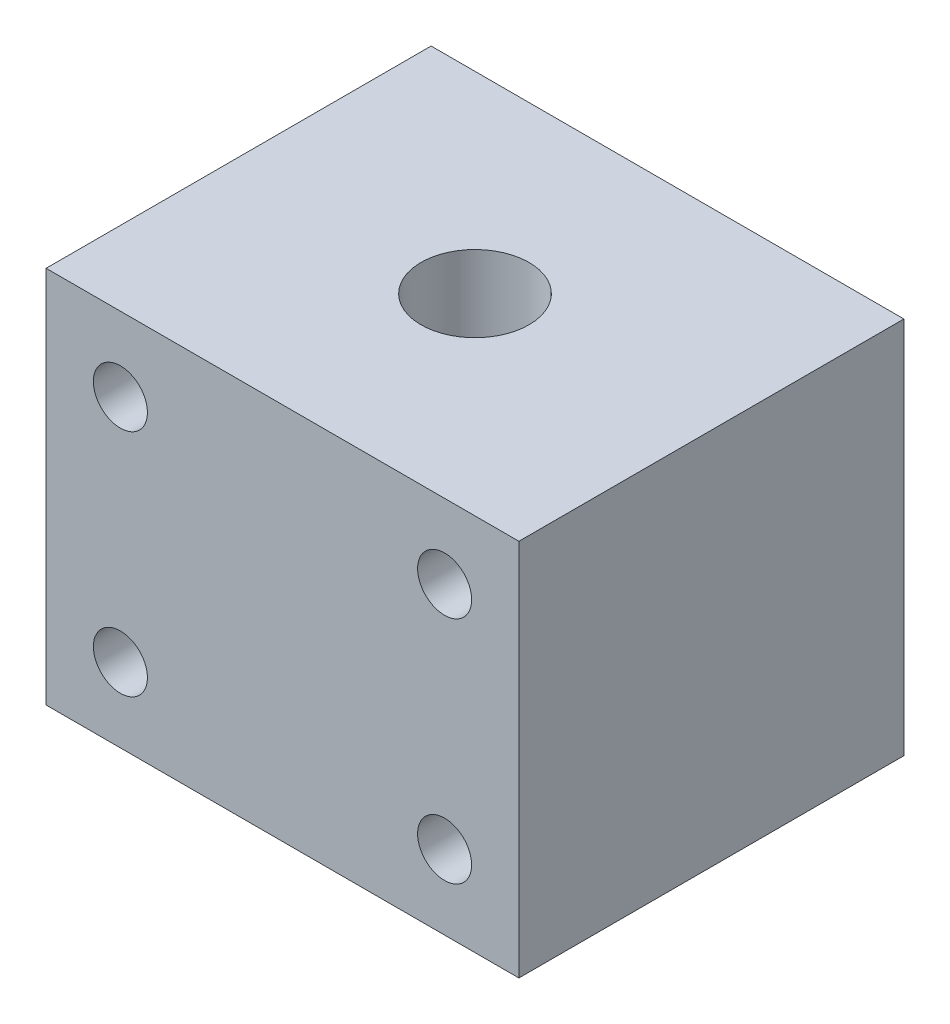
ISO-10303-21;
HEADER;
FILE_DESCRIPTION(('STEP AP214'),'2;1');
FILE_NAME('part.step','',(''),(''),'','','');
FILE_SCHEMA(('AUTOMOTIVE_DESIGN { 1 0 10303 214 1 1 1 1 }'));
ENDSEC;
DATA;
#1=APPLICATION_CONTEXT('core data for automotive mechanical design processes');
#2=APPLICATION_PROTOCOL_DEFINITION('international standard','automotive_design',2000,#1);
#3=PRODUCT_CONTEXT('',#1,'mechanical');
#4=PRODUCT('Part','Part','',(#3));
#5=PRODUCT_RELATED_PRODUCT_CATEGORY('part','',(#4));
#6=PRODUCT_DEFINITION_FORMATION('','',#4);
#7=PRODUCT_DEFINITION_CONTEXT('part definition',#1,'design');
#8=PRODUCT_DEFINITION('design','',#6,#7);
#9=PRODUCT_DEFINITION_SHAPE('','',#8);
#10=(LENGTH_UNIT() NAMED_UNIT(*) SI_UNIT(.MILLI.,.METRE.));
#11=(NAMED_UNIT(*) PLANE_ANGLE_UNIT() SI_UNIT($,.RADIAN.));
#12=(NAMED_UNIT(*) SI_UNIT($,.STERADIAN.) SOLID_ANGLE_UNIT());
#13=UNCERTAINTY_MEASURE_WITH_UNIT(LENGTH_MEASURE(1.E-05),#10,'distance_accuracy_value','');
#14=(GEOMETRIC_REPRESENTATION_CONTEXT(3) GLOBAL_UNCERTAINTY_ASSIGNED_CONTEXT((#13)) GLOBAL_UNIT_ASSIGNED_CONTEXT((#10,
#11,#12)) REPRESENTATION_CONTEXT('',''));
#15=CARTESIAN_POINT('',(0.,0.,0.));
#16=DIRECTION('',(0.,0.,1.));
#17=DIRECTION('',(1.,0.,0.));
#18=AXIS2_PLACEMENT_3D('',#15,#16,#17);
#19=CARTESIAN_POINT('',(0.,0.,28.5));
#20=DIRECTION('',(0.,0.,-1.));
#21=DIRECTION('',(-1.,0.,0.));
#22=AXIS2_PLACEMENT_3D('',#19,#20,#21);
#23=PLANE('',#22);
#24=DIRECTION('',(0.,-1.,0.));
#25=VECTOR('',#24,1.);
#26=CARTESIAN_POINT('',(0.,0.,28.5));
#27=LINE('',#26,#25);
#28=CARTESIAN_POINT('',(0.,28.,28.5));
#29=VERTEX_POINT('',#28);
#30=CARTESIAN_POINT('',(0.,0.,28.5));
#31=VERTEX_POINT('',#30);
#32=EDGE_CURVE('E85',#29,#31,#27,.T.);
#33=ORIENTED_EDGE('',*,*,#32,.T.);
#34=DIRECTION('',(1.,0.,0.));
#35=VECTOR('',#34,1.);
#36=CARTESIAN_POINT('',(0.,0.,28.5));
#37=LINE('',#36,#35);
#38=CARTESIAN_POINT('',(35.,0.,28.5));
#39=VERTEX_POINT('',#38);
#40=EDGE_CURVE('E80',#31,#39,#37,.T.);
#41=ORIENTED_EDGE('',*,*,#40,.T.);
#42=DIRECTION('',(0.,1.,0.));
#43=VECTOR('',#42,1.);
#44=CARTESIAN_POINT('',(35.,0.,28.5));
#45=LINE('',#44,#43);
#46=CARTESIAN_POINT('',(35.,28.,28.5));
#47=VERTEX_POINT('',#46);
#48=EDGE_CURVE('E83',#39,#47,#45,.T.);
#49=ORIENTED_EDGE('',*,*,#48,.T.);
#50=DIRECTION('',(-1.,0.,0.));
#51=VECTOR('',#50,1.);
#52=CARTESIAN_POINT('',(0.,28.,28.5));
#53=LINE('',#52,#51);
#54=EDGE_CURVE('E50',#47,#29,#53,.T.);
#55=ORIENTED_EDGE('',*,*,#54,.T.);
#56=EDGE_LOOP('',(#33,#41,#49,#55));
#57=FACE_BOUND('',#56,.T.);
#58=CARTESIAN_POINT('',(5.5,22.5,28.5));
#59=DIRECTION('',(0.,0.,1.));
#60=DIRECTION('',(1.,0.,0.));
#61=AXIS2_PLACEMENT_3D('',#58,#59,#60);
#62=CIRCLE('',#61,2.);
#63=CARTESIAN_POINT('',(3.5,22.5,28.5));
#64=VERTEX_POINT('',#63);
#65=EDGE_CURVE('E100',#64,#64,#62,.T.);
#66=ORIENTED_EDGE('',*,*,#65,.F.);
#67=EDGE_LOOP('',(#66));
#68=FACE_BOUND('',#67,.T.);
#69=CARTESIAN_POINT('',(29.5,22.5,28.5));
#70=DIRECTION('',(0.,0.,1.));
#71=DIRECTION('',(1.,0.,0.));
#72=AXIS2_PLACEMENT_3D('',#69,#70,#71);
#73=CIRCLE('',#72,2.);
#74=CARTESIAN_POINT('',(27.5,22.5,28.5));
#75=VERTEX_POINT('',#74);
#76=EDGE_CURVE('E115',#75,#75,#73,.T.);
#77=ORIENTED_EDGE('',*,*,#76,.F.);
#78=EDGE_LOOP('',(#77));
#79=FACE_BOUND('',#78,.T.);
#80=CARTESIAN_POINT('',(5.5,5.5,28.5));
#81=DIRECTION('',(0.,0.,1.));
#82=DIRECTION('',(1.,0.,0.));
#83=AXIS2_PLACEMENT_3D('',#80,#81,#82);
#84=CIRCLE('',#83,2.);
#85=CARTESIAN_POINT('',(3.5,5.5,28.5));
#86=VERTEX_POINT('',#85);
#87=EDGE_CURVE('E121',#86,#86,#84,.T.);
#88=ORIENTED_EDGE('',*,*,#87,.F.);
#89=EDGE_LOOP('',(#88));
#90=FACE_BOUND('',#89,.T.);
#91=CARTESIAN_POINT('',(29.5,5.5,28.5));
#92=DIRECTION('',(0.,0.,1.));
#93=DIRECTION('',(1.,0.,0.));
#94=AXIS2_PLACEMENT_3D('',#91,#92,#93);
#95=CIRCLE('',#94,2.);
#96=CARTESIAN_POINT('',(27.5,5.5,28.5));
#97=VERTEX_POINT('',#96);
#98=EDGE_CURVE('E127',#97,#97,#95,.T.);
#99=ORIENTED_EDGE('',*,*,#98,.F.);
#100=EDGE_LOOP('',(#99));
#101=FACE_BOUND('',#100,.T.);
#102=ADVANCED_FACE('F33',(#57,#68,#79,#90,#101),#23,.F.);
#103=CARTESIAN_POINT('',(0.,0.,0.));
#104=DIRECTION('',(0.,0.,-1.));
#105=DIRECTION('',(-1.,0.,0.));
#106=AXIS2_PLACEMENT_3D('',#103,#104,#105);
#107=PLANE('',#106);
#108=CARTESIAN_POINT('',(5.5,5.5,0.));
#109=DIRECTION('',(0.,0.,1.));
#110=DIRECTION('',(1.,0.,0.));
#111=AXIS2_PLACEMENT_3D('',#108,#109,#110);
#112=CIRCLE('',#111,2.);
#113=CARTESIAN_POINT('',(3.5,5.5,0.));
#114=VERTEX_POINT('',#113);
#115=EDGE_CURVE('E124',#114,#114,#112,.T.);
#116=ORIENTED_EDGE('',*,*,#115,.T.);
#117=EDGE_LOOP('',(#116));
#118=FACE_BOUND('',#117,.T.);
#119=CARTESIAN_POINT('',(5.5,22.5,0.));
#120=DIRECTION('',(0.,0.,1.));
#121=DIRECTION('',(1.,0.,0.));
#122=AXIS2_PLACEMENT_3D('',#119,#120,#121);
#123=CIRCLE('',#122,2.);
#124=CARTESIAN_POINT('',(3.5,22.5,0.));
#125=VERTEX_POINT('',#124);
#126=EDGE_CURVE('E112',#125,#125,#123,.T.);
#127=ORIENTED_EDGE('',*,*,#126,.T.);
#128=EDGE_LOOP('',(#127));
#129=FACE_BOUND('',#128,.T.);
#130=DIRECTION('',(0.,-1.,0.));
#131=VECTOR('',#130,1.);
#132=CARTESIAN_POINT('',(0.,0.,0.));
#133=LINE('',#132,#131);
#134=CARTESIAN_POINT('',(0.,28.,0.));
#135=VERTEX_POINT('',#134);
#136=CARTESIAN_POINT('',(0.,0.,0.));
#137=VERTEX_POINT('',#136);
#138=EDGE_CURVE('E97',#135,#137,#133,.T.);
#139=ORIENTED_EDGE('',*,*,#138,.F.);
#140=DIRECTION('',(-1.,0.,0.));
#141=VECTOR('',#140,1.);
#142=CARTESIAN_POINT('',(0.,28.,0.));
#143=LINE('',#142,#141);
#144=CARTESIAN_POINT('',(35.,28.,0.));
#145=VERTEX_POINT('',#144);
#146=EDGE_CURVE('E73',#145,#135,#143,.T.);
#147=ORIENTED_EDGE('',*,*,#146,.F.);
#148=DIRECTION('',(0.,1.,0.));
#149=VECTOR('',#148,1.);
#150=CARTESIAN_POINT('',(35.,0.,0.));
#151=LINE('',#150,#149);
#152=CARTESIAN_POINT('',(35.,0.,0.));
#153=VERTEX_POINT('',#152);
#154=EDGE_CURVE('E67',#153,#145,#151,.T.);
#155=ORIENTED_EDGE('',*,*,#154,.F.);
#156=DIRECTION('',(1.,0.,0.));
#157=VECTOR('',#156,1.);
#158=CARTESIAN_POINT('',(0.,0.,0.));
#159=LINE('',#158,#157);
#160=EDGE_CURVE('E89',#137,#153,#159,.T.);
#161=ORIENTED_EDGE('',*,*,#160,.F.);
#162=EDGE_LOOP('',(#139,#147,#155,#161));
#163=FACE_BOUND('',#162,.T.);
#164=CARTESIAN_POINT('',(29.5,22.5,0.));
#165=DIRECTION('',(0.,0.,1.));
#166=DIRECTION('',(1.,0.,0.));
#167=AXIS2_PLACEMENT_3D('',#164,#165,#166);
#168=CIRCLE('',#167,2.);
#169=CARTESIAN_POINT('',(27.5,22.5,0.));
#170=VERTEX_POINT('',#169);
#171=EDGE_CURVE('E118',#170,#170,#168,.T.);
#172=ORIENTED_EDGE('',*,*,#171,.T.);
#173=EDGE_LOOP('',(#172));
#174=FACE_BOUND('',#173,.T.);
#175=CARTESIAN_POINT('',(29.5,5.5,0.));
#176=DIRECTION('',(0.,0.,1.));
#177=DIRECTION('',(1.,0.,0.));
#178=AXIS2_PLACEMENT_3D('',#175,#176,#177);
#179=CIRCLE('',#178,2.);
#180=CARTESIAN_POINT('',(27.5,5.5,0.));
#181=VERTEX_POINT('',#180);
#182=EDGE_CURVE('E130',#181,#181,#179,.T.);
#183=ORIENTED_EDGE('',*,*,#182,.T.);
#184=EDGE_LOOP('',(#183));
#185=FACE_BOUND('',#184,.T.);
#186=ADVANCED_FACE('F108',(#118,#129,#163,#174,#185),#107,.T.);
#187=CARTESIAN_POINT('',(0.,0.,28.5));
#188=DIRECTION('',(1.,0.,0.));
#189=DIRECTION('',(0.,0.,-1.));
#190=AXIS2_PLACEMENT_3D('',#187,#188,#189);
#191=PLANE('',#190);
#192=ORIENTED_EDGE('',*,*,#138,.T.);
#193=DIRECTION('',(0.,0.,-1.));
#194=VECTOR('',#193,1.);
#195=CARTESIAN_POINT('',(0.,0.,28.5));
#196=LINE('',#195,#194);
#197=EDGE_CURVE('E11',#31,#137,#196,.T.);
#198=ORIENTED_EDGE('',*,*,#197,.F.);
#199=ORIENTED_EDGE('',*,*,#32,.F.);
#200=DIRECTION('',(0.,0.,-1.));
#201=VECTOR('',#200,1.);
#202=CARTESIAN_POINT('',(0.,28.,28.5));
#203=LINE('',#202,#201);
#204=EDGE_CURVE('E93',#29,#135,#203,.T.);
#205=ORIENTED_EDGE('',*,*,#204,.T.);
#206=EDGE_LOOP('',(#192,#198,#199,#205));
#207=FACE_BOUND('',#206,.T.);
#208=ADVANCED_FACE('F35',(#207),#191,.F.);
#209=CARTESIAN_POINT('',(0.,0.,28.5));
#210=DIRECTION('',(0.,1.,0.));
#211=DIRECTION('',(-1.,0.,0.));
#212=AXIS2_PLACEMENT_3D('',#209,#210,#211);
#213=PLANE('',#212);
#214=CARTESIAN_POINT('',(17.5,0.,14.25));
#215=DIRECTION('',(0.,-1.,0.));
#216=DIRECTION('',(1.,0.,0.));
#217=AXIS2_PLACEMENT_3D('',#214,#215,#216);
#218=CIRCLE('',#217,4.);
#219=CARTESIAN_POINT('',(21.5,0.,14.25));
#220=VERTEX_POINT('',#219);
#221=EDGE_CURVE('E136',#220,#220,#218,.T.);
#222=ORIENTED_EDGE('',*,*,#221,.F.);
#223=EDGE_LOOP('',(#222));
#224=FACE_BOUND('',#223,.T.);
#225=ORIENTED_EDGE('',*,*,#160,.T.);
#226=DIRECTION('',(0.,0.,-1.));
#227=VECTOR('',#226,1.);
#228=CARTESIAN_POINT('',(35.,0.,28.5));
#229=LINE('',#228,#227);
#230=EDGE_CURVE('E42',#39,#153,#229,.T.);
#231=ORIENTED_EDGE('',*,*,#230,.F.);
#232=ORIENTED_EDGE('',*,*,#40,.F.);
#233=ORIENTED_EDGE('',*,*,#197,.T.);
#234=EDGE_LOOP('',(#225,#231,#232,#233));
#235=FACE_BOUND('',#234,.T.);
#236=ADVANCED_FACE('F88',(#224,#235),#213,.F.);
#237=CARTESIAN_POINT('',(35.,0.,28.5));
#238=DIRECTION('',(-1.,0.,0.));
#239=DIRECTION('',(0.,0.,1.));
#240=AXIS2_PLACEMENT_3D('',#237,#238,#239);
#241=PLANE('',#240);
#242=ORIENTED_EDGE('',*,*,#154,.T.);
#243=DIRECTION('',(0.,0.,-1.));
#244=VECTOR('',#243,1.);
#245=CARTESIAN_POINT('',(35.,28.,28.5));
#246=LINE('',#245,#244);
#247=EDGE_CURVE('E90',#47,#145,#246,.T.);
#248=ORIENTED_EDGE('',*,*,#247,.F.);
#249=ORIENTED_EDGE('',*,*,#48,.F.);
#250=ORIENTED_EDGE('',*,*,#230,.T.);
#251=EDGE_LOOP('',(#242,#248,#249,#250));
#252=FACE_BOUND('',#251,.T.);
#253=ADVANCED_FACE('F91',(#252),#241,.F.);
#254=CARTESIAN_POINT('',(0.,28.,28.5));
#255=DIRECTION('',(0.,-1.,0.));
#256=DIRECTION('',(1.,0.,0.));
#257=AXIS2_PLACEMENT_3D('',#254,#255,#256);
#258=PLANE('',#257);
#259=CARTESIAN_POINT('',(17.5,28.,14.25));
#260=DIRECTION('',(0.,-1.,0.));
#261=DIRECTION('',(1.,0.,0.));
#262=AXIS2_PLACEMENT_3D('',#259,#260,#261);
#263=CIRCLE('',#262,4.);
#264=CARTESIAN_POINT('',(21.5,28.,14.25));
#265=VERTEX_POINT('',#264);
#266=EDGE_CURVE('E133',#265,#265,#263,.T.);
#267=ORIENTED_EDGE('',*,*,#266,.T.);
#268=EDGE_LOOP('',(#267));
#269=FACE_BOUND('',#268,.T.);
#270=ORIENTED_EDGE('',*,*,#146,.T.);
#271=ORIENTED_EDGE('',*,*,#204,.F.);
#272=ORIENTED_EDGE('',*,*,#54,.F.);
#273=ORIENTED_EDGE('',*,*,#247,.T.);
#274=EDGE_LOOP('',(#270,#271,#272,#273));
#275=FACE_BOUND('',#274,.T.);
#276=ADVANCED_FACE('F105',(#269,#275),#258,.F.);
#277=CARTESIAN_POINT('',(5.5,22.5,28.5));
#278=DIRECTION('',(0.,0.,-1.));
#279=DIRECTION('',(-1.,0.,0.));
#280=AXIS2_PLACEMENT_3D('',#277,#278,#279);
#281=CYLINDRICAL_SURFACE('',#280,2.);
#282=CARTESIAN_POINT('',(3.5,22.5,28.5));
#283=CARTESIAN_POINT('',(3.5,22.5,28.203125));
#284=CARTESIAN_POINT('',(3.5,22.5,27.90625));
#285=CARTESIAN_POINT('',(3.5,22.5,27.3125));
#286=CARTESIAN_POINT('',(3.5,22.5,27.015625));
#287=CARTESIAN_POINT('',(3.5,22.5,26.421875));
#288=CARTESIAN_POINT('',(3.5,22.5,26.125));
#289=CARTESIAN_POINT('',(3.5,22.5,25.53125));
#290=CARTESIAN_POINT('',(3.5,22.5,25.234375));
#291=CARTESIAN_POINT('',(3.5,22.5,24.640625));
#292=CARTESIAN_POINT('',(3.5,22.5,24.34375));
#293=CARTESIAN_POINT('',(3.5,22.5,23.75));
#294=CARTESIAN_POINT('',(3.5,22.5,23.453125));
#295=CARTESIAN_POINT('',(3.5,22.5,22.859375));
#296=CARTESIAN_POINT('',(3.5,22.5,22.5625));
#297=CARTESIAN_POINT('',(3.5,22.5,21.96875));
#298=CARTESIAN_POINT('',(3.5,22.5,21.671875));
#299=CARTESIAN_POINT('',(3.5,22.5,21.078125));
#300=CARTESIAN_POINT('',(3.5,22.5,20.78125));
#301=CARTESIAN_POINT('',(3.5,22.5,20.1875));
#302=CARTESIAN_POINT('',(3.5,22.5,19.890625));
#303=CARTESIAN_POINT('',(3.5,22.5,19.296875));
#304=CARTESIAN_POINT('',(3.5,22.5,19.));
#305=CARTESIAN_POINT('',(3.5,22.5,18.40625));
#306=CARTESIAN_POINT('',(3.5,22.5,18.109375));
#307=CARTESIAN_POINT('',(3.5,22.5,17.515625));
#308=CARTESIAN_POINT('',(3.5,22.5,17.21875));
#309=CARTESIAN_POINT('',(3.5,22.5,16.625));
#310=CARTESIAN_POINT('',(3.5,22.5,16.328125));
#311=CARTESIAN_POINT('',(3.5,22.5,15.734375));
#312=CARTESIAN_POINT('',(3.5,22.5,15.4375));
#313=CARTESIAN_POINT('',(3.5,22.5,14.84375));
#314=CARTESIAN_POINT('',(3.5,22.5,14.546875));
#315=CARTESIAN_POINT('',(3.5,22.5,13.953125));
#316=CARTESIAN_POINT('',(3.5,22.5,13.65625));
#317=CARTESIAN_POINT('',(3.5,22.5,13.0625));
#318=CARTESIAN_POINT('',(3.5,22.5,12.765625));
#319=CARTESIAN_POINT('',(3.5,22.5,12.171875));
#320=CARTESIAN_POINT('',(3.5,22.5,11.875));
#321=CARTESIAN_POINT('',(3.5,22.5,11.28125));
#322=CARTESIAN_POINT('',(3.5,22.5,10.984375));
#323=CARTESIAN_POINT('',(3.5,22.5,10.390625));
#324=CARTESIAN_POINT('',(3.5,22.5,10.09375));
#325=CARTESIAN_POINT('',(3.5,22.5,9.5));
#326=CARTESIAN_POINT('',(3.5,22.5,9.203125));
#327=CARTESIAN_POINT('',(3.5,22.5,8.609375));
#328=CARTESIAN_POINT('',(3.5,22.5,8.3125));
#329=CARTESIAN_POINT('',(3.5,22.5,7.71875));
#330=CARTESIAN_POINT('',(3.5,22.5,7.421875));
#331=CARTESIAN_POINT('',(3.5,22.5,6.828125));
#332=CARTESIAN_POINT('',(3.5,22.5,6.53125));
#333=CARTESIAN_POINT('',(3.5,22.5,5.9375));
#334=CARTESIAN_POINT('',(3.5,22.5,5.640625));
#335=CARTESIAN_POINT('',(3.5,22.5,5.046875));
#336=CARTESIAN_POINT('',(3.5,22.5,4.75));
#337=CARTESIAN_POINT('',(3.5,22.5,4.15625));
#338=CARTESIAN_POINT('',(3.5,22.5,3.859375));
#339=CARTESIAN_POINT('',(3.5,22.5,3.265625));
#340=CARTESIAN_POINT('',(3.5,22.5,2.96875));
#341=CARTESIAN_POINT('',(3.5,22.5,2.375));
#342=CARTESIAN_POINT('',(3.5,22.5,2.078125));
#343=CARTESIAN_POINT('',(3.5,22.5,1.484375));
#344=CARTESIAN_POINT('',(3.5,22.5,1.1875));
#345=CARTESIAN_POINT('',(3.5,22.5,0.593749999999999));
#346=CARTESIAN_POINT('',(3.5,22.5,0.296875));
#347=CARTESIAN_POINT('',(3.5,22.5,0.));
#348=B_SPLINE_CURVE_WITH_KNOTS('',3,(#282,#283,#284,#285,#286,#287,#288,#289,#290,#291,#292,
#293,#294,#295,#296,#297,#298,#299,#300,#301,#302,#303,#304,#305,#306,#307,#308,#309,#310,#311,
#312,#313,#314,#315,#316,#317,#318,#319,#320,#321,#322,#323,#324,#325,#326,#327,#328,#329,#330,
#331,#332,#333,#334,#335,#336,#337,#338,#339,#340,#341,#342,#343,#344,#345,#346,#347),
.UNSPECIFIED.,.F.,.F.,(4,2,2,2,2,2,2,2,2,2,2,2,2,2,2,2,2,2,2,2,2,2,2,2,2,2,2,2,2,2,2,2,4),(0.,
0.890625000000003,1.78125,2.671875,3.5625,4.453125,5.34375,6.234375,7.125,8.015625,8.90625,
9.796875,10.6875,11.578125,12.46875,13.359375,14.25,15.140625,16.03125,16.921875,17.8125,
18.703125,19.59375,20.484375,21.375,22.265625,23.15625,24.046875,24.9375,25.828125,26.71875,
27.609375,28.5),.UNSPECIFIED.);
#349=EDGE_CURVE('BSEAM164',#64,#125,#348,.T.);
#350=ORIENTED_EDGE('',*,*,#65,.T.);
#351=ORIENTED_EDGE('',*,*,#126,.F.);
#352=ORIENTED_EDGE('',*,*,#349,.T.);
#353=ORIENTED_EDGE('',*,*,#349,.F.);
#354=EDGE_LOOP('',(#350,#352,#351,#353));
#355=FACE_BOUND('',#354,.T.);
#356=ADVANCED_FACE('F164',(#355),#281,.F.);
#357=CARTESIAN_POINT('',(29.5,22.5,28.5));
#358=DIRECTION('',(0.,0.,-1.));
#359=DIRECTION('',(-1.,0.,0.));
#360=AXIS2_PLACEMENT_3D('',#357,#358,#359);
#361=CYLINDRICAL_SURFACE('',#360,2.);
#362=CARTESIAN_POINT('',(27.5,22.5,28.5));
#363=CARTESIAN_POINT('',(27.5,22.5,28.203125));
#364=CARTESIAN_POINT('',(27.5,22.5,27.90625));
#365=CARTESIAN_POINT('',(27.5,22.5,27.3125));
#366=CARTESIAN_POINT('',(27.5,22.5,27.015625));
#367=CARTESIAN_POINT('',(27.5,22.5,26.421875));
#368=CARTESIAN_POINT('',(27.5,22.5,26.125));
#369=CARTESIAN_POINT('',(27.5,22.5,25.53125));
#370=CARTESIAN_POINT('',(27.5,22.5,25.234375));
#371=CARTESIAN_POINT('',(27.5,22.5,24.640625));
#372=CARTESIAN_POINT('',(27.5,22.5,24.34375));
#373=CARTESIAN_POINT('',(27.5,22.5,23.75));
#374=CARTESIAN_POINT('',(27.5,22.5,23.453125));
#375=CARTESIAN_POINT('',(27.5,22.5,22.859375));
#376=CARTESIAN_POINT('',(27.5,22.5,22.5625));
#377=CARTESIAN_POINT('',(27.5,22.5,21.96875));
#378=CARTESIAN_POINT('',(27.5,22.5,21.671875));
#379=CARTESIAN_POINT('',(27.5,22.5,21.078125));
#380=CARTESIAN_POINT('',(27.5,22.5,20.78125));
#381=CARTESIAN_POINT('',(27.5,22.5,20.1875));
#382=CARTESIAN_POINT('',(27.5,22.5,19.890625));
#383=CARTESIAN_POINT('',(27.5,22.5,19.296875));
#384=CARTESIAN_POINT('',(27.5,22.5,19.));
#385=CARTESIAN_POINT('',(27.5,22.5,18.40625));
#386=CARTESIAN_POINT('',(27.5,22.5,18.109375));
#387=CARTESIAN_POINT('',(27.5,22.5,17.515625));
#388=CARTESIAN_POINT('',(27.5,22.5,17.21875));
#389=CARTESIAN_POINT('',(27.5,22.5,16.625));
#390=CARTESIAN_POINT('',(27.5,22.5,16.328125));
#391=CARTESIAN_POINT('',(27.5,22.5,15.734375));
#392=CARTESIAN_POINT('',(27.5,22.5,15.4375));
#393=CARTESIAN_POINT('',(27.5,22.5,14.84375));
#394=CARTESIAN_POINT('',(27.5,22.5,14.546875));
#395=CARTESIAN_POINT('',(27.5,22.5,13.953125));
#396=CARTESIAN_POINT('',(27.5,22.5,13.65625));
#397=CARTESIAN_POINT('',(27.5,22.5,13.0625));
#398=CARTESIAN_POINT('',(27.5,22.5,12.765625));
#399=CARTESIAN_POINT('',(27.5,22.5,12.171875));
#400=CARTESIAN_POINT('',(27.5,22.5,11.875));
#401=CARTESIAN_POINT('',(27.5,22.5,11.28125));
#402=CARTESIAN_POINT('',(27.5,22.5,10.984375));
#403=CARTESIAN_POINT('',(27.5,22.5,10.390625));
#404=CARTESIAN_POINT('',(27.5,22.5,10.09375));
#405=CARTESIAN_POINT('',(27.5,22.5,9.5));
#406=CARTESIAN_POINT('',(27.5,22.5,9.203125));
#407=CARTESIAN_POINT('',(27.5,22.5,8.609375));
#408=CARTESIAN_POINT('',(27.5,22.5,8.3125));
#409=CARTESIAN_POINT('',(27.5,22.5,7.71875));
#410=CARTESIAN_POINT('',(27.5,22.5,7.421875));
#411=CARTESIAN_POINT('',(27.5,22.5,6.828125));
#412=CARTESIAN_POINT('',(27.5,22.5,6.53125));
#413=CARTESIAN_POINT('',(27.5,22.5,5.9375));
#414=CARTESIAN_POINT('',(27.5,22.5,5.640625));
#415=CARTESIAN_POINT('',(27.5,22.5,5.046875));
#416=CARTESIAN_POINT('',(27.5,22.5,4.75));
#417=CARTESIAN_POINT('',(27.5,22.5,4.15625));
#418=CARTESIAN_POINT('',(27.5,22.5,3.859375));
#419=CARTESIAN_POINT('',(27.5,22.5,3.265625));
#420=CARTESIAN_POINT('',(27.5,22.5,2.96875));
#421=CARTESIAN_POINT('',(27.5,22.5,2.375));
#422=CARTESIAN_POINT('',(27.5,22.5,2.078125));
#423=CARTESIAN_POINT('',(27.5,22.5,1.484375));
#424=CARTESIAN_POINT('',(27.5,22.5,1.1875));
#425=CARTESIAN_POINT('',(27.5,22.5,0.593749999999999));
#426=CARTESIAN_POINT('',(27.5,22.5,0.296875));
#427=CARTESIAN_POINT('',(27.5,22.5,0.));
#428=B_SPLINE_CURVE_WITH_KNOTS('',3,(#362,#363,#364,#365,#366,#367,#368,#369,#370,#371,#372,
#373,#374,#375,#376,#377,#378,#379,#380,#381,#382,#383,#384,#385,#386,#387,#388,#389,#390,#391,
#392,#393,#394,#395,#396,#397,#398,#399,#400,#401,#402,#403,#404,#405,#406,#407,#408,#409,#410,
#411,#412,#413,#414,#415,#416,#417,#418,#419,#420,#421,#422,#423,#424,#425,#426,#427),
.UNSPECIFIED.,.F.,.F.,(4,2,2,2,2,2,2,2,2,2,2,2,2,2,2,2,2,2,2,2,2,2,2,2,2,2,2,2,2,2,2,2,4),(0.,
0.890625000000003,1.78125,2.671875,3.5625,4.453125,5.34375,6.234375,7.125,8.015625,8.90625,
9.796875,10.6875,11.578125,12.46875,13.359375,14.25,15.140625,16.03125,16.921875,17.8125,
18.703125,19.59375,20.484375,21.375,22.265625,23.15625,24.046875,24.9375,25.828125,26.71875,
27.609375,28.5),.UNSPECIFIED.);
#429=EDGE_CURVE('BSEAM171',#75,#170,#428,.T.);
#430=ORIENTED_EDGE('',*,*,#76,.T.);
#431=ORIENTED_EDGE('',*,*,#171,.F.);
#432=ORIENTED_EDGE('',*,*,#429,.T.);
#433=ORIENTED_EDGE('',*,*,#429,.F.);
#434=EDGE_LOOP('',(#430,#432,#431,#433));
#435=FACE_BOUND('',#434,.T.);
#436=ADVANCED_FACE('F171',(#435),#361,.F.);
#437=CARTESIAN_POINT('',(5.5,5.5,28.5));
#438=DIRECTION('',(0.,0.,-1.));
#439=DIRECTION('',(-1.,0.,0.));
#440=AXIS2_PLACEMENT_3D('',#437,#438,#439);
#441=CYLINDRICAL_SURFACE('',#440,2.);
#442=CARTESIAN_POINT('',(3.5,5.5,28.5));
#443=CARTESIAN_POINT('',(3.5,5.5,28.203125));
#444=CARTESIAN_POINT('',(3.5,5.5,27.90625));
#445=CARTESIAN_POINT('',(3.5,5.5,27.3125));
#446=CARTESIAN_POINT('',(3.5,5.5,27.015625));
#447=CARTESIAN_POINT('',(3.5,5.5,26.421875));
#448=CARTESIAN_POINT('',(3.5,5.5,26.125));
#449=CARTESIAN_POINT('',(3.5,5.5,25.53125));
#450=CARTESIAN_POINT('',(3.5,5.5,25.234375));
#451=CARTESIAN_POINT('',(3.5,5.5,24.640625));
#452=CARTESIAN_POINT('',(3.5,5.5,24.34375));
#453=CARTESIAN_POINT('',(3.5,5.5,23.75));
#454=CARTESIAN_POINT('',(3.5,5.5,23.453125));
#455=CARTESIAN_POINT('',(3.5,5.5,22.859375));
#456=CARTESIAN_POINT('',(3.5,5.5,22.5625));
#457=CARTESIAN_POINT('',(3.5,5.5,21.96875));
#458=CARTESIAN_POINT('',(3.5,5.5,21.671875));
#459=CARTESIAN_POINT('',(3.5,5.5,21.078125));
#460=CARTESIAN_POINT('',(3.5,5.5,20.78125));
#461=CARTESIAN_POINT('',(3.5,5.5,20.1875));
#462=CARTESIAN_POINT('',(3.5,5.5,19.890625));
#463=CARTESIAN_POINT('',(3.5,5.5,19.296875));
#464=CARTESIAN_POINT('',(3.5,5.5,19.));
#465=CARTESIAN_POINT('',(3.5,5.5,18.40625));
#466=CARTESIAN_POINT('',(3.5,5.5,18.109375));
#467=CARTESIAN_POINT('',(3.5,5.5,17.515625));
#468=CARTESIAN_POINT('',(3.5,5.5,17.21875));
#469=CARTESIAN_POINT('',(3.5,5.5,16.625));
#470=CARTESIAN_POINT('',(3.5,5.5,16.328125));
#471=CARTESIAN_POINT('',(3.5,5.5,15.734375));
#472=CARTESIAN_POINT('',(3.5,5.5,15.4375));
#473=CARTESIAN_POINT('',(3.5,5.5,14.84375));
#474=CARTESIAN_POINT('',(3.5,5.5,14.546875));
#475=CARTESIAN_POINT('',(3.5,5.5,13.953125));
#476=CARTESIAN_POINT('',(3.5,5.5,13.65625));
#477=CARTESIAN_POINT('',(3.5,5.5,13.0625));
#478=CARTESIAN_POINT('',(3.5,5.5,12.765625));
#479=CARTESIAN_POINT('',(3.5,5.5,12.171875));
#480=CARTESIAN_POINT('',(3.5,5.5,11.875));
#481=CARTESIAN_POINT('',(3.5,5.5,11.28125));
#482=CARTESIAN_POINT('',(3.5,5.5,10.984375));
#483=CARTESIAN_POINT('',(3.5,5.5,10.390625));
#484=CARTESIAN_POINT('',(3.5,5.5,10.09375));
#485=CARTESIAN_POINT('',(3.5,5.5,9.5));
#486=CARTESIAN_POINT('',(3.5,5.5,9.203125));
#487=CARTESIAN_POINT('',(3.5,5.5,8.609375));
#488=CARTESIAN_POINT('',(3.5,5.5,8.3125));
#489=CARTESIAN_POINT('',(3.5,5.5,7.71875));
#490=CARTESIAN_POINT('',(3.5,5.5,7.421875));
#491=CARTESIAN_POINT('',(3.5,5.5,6.828125));
#492=CARTESIAN_POINT('',(3.5,5.5,6.53125));
#493=CARTESIAN_POINT('',(3.5,5.5,5.9375));
#494=CARTESIAN_POINT('',(3.5,5.5,5.640625));
#495=CARTESIAN_POINT('',(3.5,5.5,5.046875));
#496=CARTESIAN_POINT('',(3.5,5.5,4.75));
#497=CARTESIAN_POINT('',(3.5,5.5,4.15625));
#498=CARTESIAN_POINT('',(3.5,5.5,3.859375));
#499=CARTESIAN_POINT('',(3.5,5.5,3.265625));
#500=CARTESIAN_POINT('',(3.5,5.5,2.96875));
#501=CARTESIAN_POINT('',(3.5,5.5,2.375));
#502=CARTESIAN_POINT('',(3.5,5.5,2.078125));
#503=CARTESIAN_POINT('',(3.5,5.5,1.484375));
#504=CARTESIAN_POINT('',(3.5,5.5,1.1875));
#505=CARTESIAN_POINT('',(3.5,5.5,0.593749999999999));
#506=CARTESIAN_POINT('',(3.5,5.5,0.296875));
#507=CARTESIAN_POINT('',(3.5,5.5,0.));
#508=B_SPLINE_CURVE_WITH_KNOTS('',3,(#442,#443,#444,#445,#446,#447,#448,#449,#450,#451,#452,
#453,#454,#455,#456,#457,#458,#459,#460,#461,#462,#463,#464,#465,#466,#467,#468,#469,#470,#471,
#472,#473,#474,#475,#476,#477,#478,#479,#480,#481,#482,#483,#484,#485,#486,#487,#488,#489,#490,
#491,#492,#493,#494,#495,#496,#497,#498,#499,#500,#501,#502,#503,#504,#505,#506,#507),
.UNSPECIFIED.,.F.,.F.,(4,2,2,2,2,2,2,2,2,2,2,2,2,2,2,2,2,2,2,2,2,2,2,2,2,2,2,2,2,2,2,2,4),(0.,
0.890625000000003,1.78125,2.671875,3.5625,4.453125,5.34375,6.234375,7.125,8.015625,8.90625,
9.796875,10.6875,11.578125,12.46875,13.359375,14.25,15.140625,16.03125,16.921875,17.8125,
18.703125,19.59375,20.484375,21.375,22.265625,23.15625,24.046875,24.9375,25.828125,26.71875,
27.609375,28.5),.UNSPECIFIED.);
#509=EDGE_CURVE('BSEAM176',#86,#114,#508,.T.);
#510=ORIENTED_EDGE('',*,*,#87,.T.);
#511=ORIENTED_EDGE('',*,*,#115,.F.);
#512=ORIENTED_EDGE('',*,*,#509,.T.);
#513=ORIENTED_EDGE('',*,*,#509,.F.);
#514=EDGE_LOOP('',(#510,#512,#511,#513));
#515=FACE_BOUND('',#514,.T.);
#516=ADVANCED_FACE('F176',(#515),#441,.F.);
#517=CARTESIAN_POINT('',(29.5,5.5,28.5));
#518=DIRECTION('',(0.,0.,-1.));
#519=DIRECTION('',(-1.,0.,0.));
#520=AXIS2_PLACEMENT_3D('',#517,#518,#519);
#521=CYLINDRICAL_SURFACE('',#520,2.);
#522=CARTESIAN_POINT('',(27.5,5.5,28.5));
#523=CARTESIAN_POINT('',(27.5,5.5,28.203125));
#524=CARTESIAN_POINT('',(27.5,5.5,27.90625));
#525=CARTESIAN_POINT('',(27.5,5.5,27.3125));
#526=CARTESIAN_POINT('',(27.5,5.5,27.015625));
#527=CARTESIAN_POINT('',(27.5,5.5,26.421875));
#528=CARTESIAN_POINT('',(27.5,5.5,26.125));
#529=CARTESIAN_POINT('',(27.5,5.5,25.53125));
#530=CARTESIAN_POINT('',(27.5,5.5,25.234375));
#531=CARTESIAN_POINT('',(27.5,5.5,24.640625));
#532=CARTESIAN_POINT('',(27.5,5.5,24.34375));
#533=CARTESIAN_POINT('',(27.5,5.5,23.75));
#534=CARTESIAN_POINT('',(27.5,5.5,23.453125));
#535=CARTESIAN_POINT('',(27.5,5.5,22.859375));
#536=CARTESIAN_POINT('',(27.5,5.5,22.5625));
#537=CARTESIAN_POINT('',(27.5,5.5,21.96875));
#538=CARTESIAN_POINT('',(27.5,5.5,21.671875));
#539=CARTESIAN_POINT('',(27.5,5.5,21.078125));
#540=CARTESIAN_POINT('',(27.5,5.5,20.78125));
#541=CARTESIAN_POINT('',(27.5,5.5,20.1875));
#542=CARTESIAN_POINT('',(27.5,5.5,19.890625));
#543=CARTESIAN_POINT('',(27.5,5.5,19.296875));
#544=CARTESIAN_POINT('',(27.5,5.5,19.));
#545=CARTESIAN_POINT('',(27.5,5.5,18.40625));
#546=CARTESIAN_POINT('',(27.5,5.5,18.109375));
#547=CARTESIAN_POINT('',(27.5,5.5,17.515625));
#548=CARTESIAN_POINT('',(27.5,5.5,17.21875));
#549=CARTESIAN_POINT('',(27.5,5.5,16.625));
#550=CARTESIAN_POINT('',(27.5,5.5,16.328125));
#551=CARTESIAN_POINT('',(27.5,5.5,15.734375));
#552=CARTESIAN_POINT('',(27.5,5.5,15.4375));
#553=CARTESIAN_POINT('',(27.5,5.5,14.84375));
#554=CARTESIAN_POINT('',(27.5,5.5,14.546875));
#555=CARTESIAN_POINT('',(27.5,5.5,13.953125));
#556=CARTESIAN_POINT('',(27.5,5.5,13.65625));
#557=CARTESIAN_POINT('',(27.5,5.5,13.0625));
#558=CARTESIAN_POINT('',(27.5,5.5,12.765625));
#559=CARTESIAN_POINT('',(27.5,5.5,12.171875));
#560=CARTESIAN_POINT('',(27.5,5.5,11.875));
#561=CARTESIAN_POINT('',(27.5,5.5,11.28125));
#562=CARTESIAN_POINT('',(27.5,5.5,10.984375));
#563=CARTESIAN_POINT('',(27.5,5.5,10.390625));
#564=CARTESIAN_POINT('',(27.5,5.5,10.09375));
#565=CARTESIAN_POINT('',(27.5,5.5,9.5));
#566=CARTESIAN_POINT('',(27.5,5.5,9.203125));
#567=CARTESIAN_POINT('',(27.5,5.5,8.609375));
#568=CARTESIAN_POINT('',(27.5,5.5,8.3125));
#569=CARTESIAN_POINT('',(27.5,5.5,7.71875));
#570=CARTESIAN_POINT('',(27.5,5.5,7.421875));
#571=CARTESIAN_POINT('',(27.5,5.5,6.828125));
#572=CARTESIAN_POINT('',(27.5,5.5,6.53125));
#573=CARTESIAN_POINT('',(27.5,5.5,5.9375));
#574=CARTESIAN_POINT('',(27.5,5.5,5.640625));
#575=CARTESIAN_POINT('',(27.5,5.5,5.046875));
#576=CARTESIAN_POINT('',(27.5,5.5,4.75));
#577=CARTESIAN_POINT('',(27.5,5.5,4.15625));
#578=CARTESIAN_POINT('',(27.5,5.5,3.859375));
#579=CARTESIAN_POINT('',(27.5,5.5,3.265625));
#580=CARTESIAN_POINT('',(27.5,5.5,2.96875));
#581=CARTESIAN_POINT('',(27.5,5.5,2.375));
#582=CARTESIAN_POINT('',(27.5,5.5,2.078125));
#583=CARTESIAN_POINT('',(27.5,5.5,1.484375));
#584=CARTESIAN_POINT('',(27.5,5.5,1.1875));
#585=CARTESIAN_POINT('',(27.5,5.5,0.593749999999999));
#586=CARTESIAN_POINT('',(27.5,5.5,0.296875));
#587=CARTESIAN_POINT('',(27.5,5.5,0.));
#588=B_SPLINE_CURVE_WITH_KNOTS('',3,(#522,#523,#524,#525,#526,#527,#528,#529,#530,#531,#532,
#533,#534,#535,#536,#537,#538,#539,#540,#541,#542,#543,#544,#545,#546,#547,#548,#549,#550,#551,
#552,#553,#554,#555,#556,#557,#558,#559,#560,#561,#562,#563,#564,#565,#566,#567,#568,#569,#570,
#571,#572,#573,#574,#575,#576,#577,#578,#579,#580,#581,#582,#583,#584,#585,#586,#587),
.UNSPECIFIED.,.F.,.F.,(4,2,2,2,2,2,2,2,2,2,2,2,2,2,2,2,2,2,2,2,2,2,2,2,2,2,2,2,2,2,2,2,4),(0.,
0.890625000000003,1.78125,2.671875,3.5625,4.453125,5.34375,6.234375,7.125,8.015625,8.90625,
9.796875,10.6875,11.578125,12.46875,13.359375,14.25,15.140625,16.03125,16.921875,17.8125,
18.703125,19.59375,20.484375,21.375,22.265625,23.15625,24.046875,24.9375,25.828125,26.71875,
27.609375,28.5),.UNSPECIFIED.);
#589=EDGE_CURVE('BSEAM146',#97,#181,#588,.T.);
#590=ORIENTED_EDGE('',*,*,#98,.T.);
#591=ORIENTED_EDGE('',*,*,#182,.F.);
#592=ORIENTED_EDGE('',*,*,#589,.T.);
#593=ORIENTED_EDGE('',*,*,#589,.F.);
#594=EDGE_LOOP('',(#590,#592,#591,#593));
#595=FACE_BOUND('',#594,.T.);
#596=ADVANCED_FACE('F146',(#595),#521,.F.);
#597=CARTESIAN_POINT('',(17.5,28.,14.25));
#598=DIRECTION('',(0.,-1.,0.));
#599=DIRECTION('',(1.,0.,0.));
#600=AXIS2_PLACEMENT_3D('',#597,#598,#599);
#601=CYLINDRICAL_SURFACE('',#600,4.);
#602=CARTESIAN_POINT('',(21.5,28.,14.25));
#603=CARTESIAN_POINT('',(21.5,27.7083333333334,14.25));
#604=CARTESIAN_POINT('',(21.5,27.4166666666667,14.25));
#605=CARTESIAN_POINT('',(21.5,26.8333333333334,14.25));
#606=CARTESIAN_POINT('',(21.5,26.5416666666667,14.25));
#607=CARTESIAN_POINT('',(21.5,25.9583333333334,14.25));
#608=CARTESIAN_POINT('',(21.5,25.6666666666667,14.25));
#609=CARTESIAN_POINT('',(21.5,25.0833333333334,14.25));
#610=CARTESIAN_POINT('',(21.5,24.7916666666667,14.25));
#611=CARTESIAN_POINT('',(21.5,24.2083333333334,14.25));
#612=CARTESIAN_POINT('',(21.5,23.9166666666667,14.25));
#613=CARTESIAN_POINT('',(21.5,23.3333333333334,14.25));
#614=CARTESIAN_POINT('',(21.5,23.0416666666667,14.25));
#615=CARTESIAN_POINT('',(21.5,22.4583333333334,14.25));
#616=CARTESIAN_POINT('',(21.5,22.1666666666667,14.25));
#617=CARTESIAN_POINT('',(21.5,21.5833333333334,14.25));
#618=CARTESIAN_POINT('',(21.5,21.2916666666667,14.25));
#619=CARTESIAN_POINT('',(21.5,20.7083333333334,14.25));
#620=CARTESIAN_POINT('',(21.5,20.4166666666667,14.25));
#621=CARTESIAN_POINT('',(21.5,19.8333333333334,14.25));
#622=CARTESIAN_POINT('',(21.5,19.5416666666667,14.25));
#623=CARTESIAN_POINT('',(21.5,18.9583333333334,14.25));
#624=CARTESIAN_POINT('',(21.5,18.6666666666667,14.25));
#625=CARTESIAN_POINT('',(21.5,18.0833333333334,14.25));
#626=CARTESIAN_POINT('',(21.5,17.7916666666667,14.25));
#627=CARTESIAN_POINT('',(21.5,17.2083333333334,14.25));
#628=CARTESIAN_POINT('',(21.5,16.9166666666667,14.25));
#629=CARTESIAN_POINT('',(21.5,16.3333333333334,14.25));
#630=CARTESIAN_POINT('',(21.5,16.0416666666667,14.25));
#631=CARTESIAN_POINT('',(21.5,15.4583333333333,14.25));
#632=CARTESIAN_POINT('',(21.5,15.1666666666667,14.25));
#633=CARTESIAN_POINT('',(21.5,14.5833333333333,14.25));
#634=CARTESIAN_POINT('',(21.5,14.2916666666667,14.25));
#635=CARTESIAN_POINT('',(21.5,13.7083333333333,14.25));
#636=CARTESIAN_POINT('',(21.5,13.4166666666667,14.25));
#637=CARTESIAN_POINT('',(21.5,12.8333333333333,14.25));
#638=CARTESIAN_POINT('',(21.5,12.5416666666667,14.25));
#639=CARTESIAN_POINT('',(21.5,11.9583333333333,14.25));
#640=CARTESIAN_POINT('',(21.5,11.6666666666667,14.25));
#641=CARTESIAN_POINT('',(21.5,11.0833333333333,14.25));
#642=CARTESIAN_POINT('',(21.5,10.7916666666667,14.25));
#643=CARTESIAN_POINT('',(21.5,10.2083333333333,14.25));
#644=CARTESIAN_POINT('',(21.5,9.91666666666668,14.25));
#645=CARTESIAN_POINT('',(21.5,9.33333333333334,14.25));
#646=CARTESIAN_POINT('',(21.5,9.04166666666668,14.25));
#647=CARTESIAN_POINT('',(21.5,8.45833333333334,14.25));
#648=CARTESIAN_POINT('',(21.5,8.16666666666668,14.25));
#649=CARTESIAN_POINT('',(21.5,7.58333333333334,14.25));
#650=CARTESIAN_POINT('',(21.5,7.29166666666668,14.25));
#651=CARTESIAN_POINT('',(21.5,6.70833333333334,14.25));
#652=CARTESIAN_POINT('',(21.5,6.41666666666668,14.25));
#653=CARTESIAN_POINT('',(21.5,5.83333333333334,14.25));
#654=CARTESIAN_POINT('',(21.5,5.54166666666667,14.25));
#655=CARTESIAN_POINT('',(21.5,4.95833333333334,14.25));
#656=CARTESIAN_POINT('',(21.5,4.66666666666667,14.25));
#657=CARTESIAN_POINT('',(21.5,4.08333333333334,14.25));
#658=CARTESIAN_POINT('',(21.5,3.79166666666667,14.25));
#659=CARTESIAN_POINT('',(21.5,3.20833333333334,14.25));
#660=CARTESIAN_POINT('',(21.5,2.91666666666667,14.25));
#661=CARTESIAN_POINT('',(21.5,2.33333333333334,14.25));
#662=CARTESIAN_POINT('',(21.5,2.04166666666667,14.25));
#663=CARTESIAN_POINT('',(21.5,1.45833333333334,14.25));
#664=CARTESIAN_POINT('',(21.5,1.16666666666667,14.25));
#665=CARTESIAN_POINT('',(21.5,0.583333333333337,14.25));
#666=CARTESIAN_POINT('',(21.5,0.29166666666667,14.25));
#667=CARTESIAN_POINT('',(21.5,0.,14.25));
#668=B_SPLINE_CURVE_WITH_KNOTS('',3,(#602,#603,#604,#605,#606,#607,#608,#609,#610,#611,#612,
#613,#614,#615,#616,#617,#618,#619,#620,#621,#622,#623,#624,#625,#626,#627,#628,#629,#630,#631,
#632,#633,#634,#635,#636,#637,#638,#639,#640,#641,#642,#643,#644,#645,#646,#647,#648,#649,#650,
#651,#652,#653,#654,#655,#656,#657,#658,#659,#660,#661,#662,#663,#664,#665,#666,#667),
.UNSPECIFIED.,.F.,.F.,(4,2,2,2,2,2,2,2,2,2,2,2,2,2,2,2,2,2,2,2,2,2,2,2,2,2,2,2,2,2,2,2,4),(0.,
0.874999999999997,1.75,2.625,3.5,4.375,5.25,6.125,7.,7.875,8.75,9.62500000000001,10.5,11.375,
12.25,13.125,14.,14.875,15.75,16.625,17.5,18.375,19.25,20.125,21.,21.875,22.75,23.625,24.5,
25.375,26.25,27.125,28.),.UNSPECIFIED.);
#669=EDGE_CURVE('BSEAM143',#265,#220,#668,.T.);
#670=ORIENTED_EDGE('',*,*,#266,.F.);
#671=ORIENTED_EDGE('',*,*,#221,.T.);
#672=ORIENTED_EDGE('',*,*,#669,.T.);
#673=ORIENTED_EDGE('',*,*,#669,.F.);
#674=EDGE_LOOP('',(#670,#672,#671,#673));
#675=FACE_BOUND('',#674,.T.);
#676=ADVANCED_FACE('F143',(#675),#601,.F.);
#677=CLOSED_SHELL('',(#102,#186,#208,#236,#253,#276,#356,#436,#516,#596,#676));
#678=MANIFOLD_SOLID_BREP('B2',#677);
#679=ADVANCED_BREP_SHAPE_REPRESENTATION('',(#18,#678),#14);
#680=SHAPE_DEFINITION_REPRESENTATION(#9,#679);
ENDSEC;
END-ISO-10303-21;
